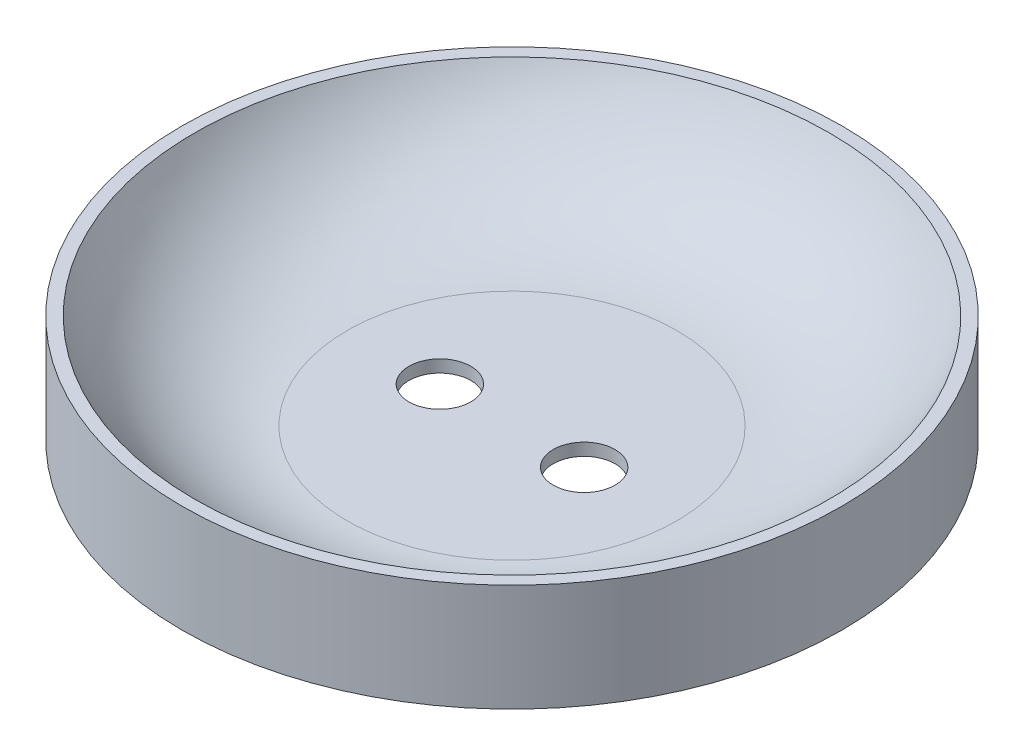
ISO-10303-21;
HEADER;
FILE_DESCRIPTION(('STEP AP214'),'2;1');
FILE_NAME('part.step','',(''),(''),'','','');
FILE_SCHEMA(('AUTOMOTIVE_DESIGN { 1 0 10303 214 1 1 1 1 }'));
ENDSEC;
DATA;
#1=APPLICATION_CONTEXT('core data for automotive mechanical design processes');
#2=APPLICATION_PROTOCOL_DEFINITION('international standard','automotive_design',2000,#1);
#3=PRODUCT_CONTEXT('',#1,'mechanical');
#4=PRODUCT('Part','Part','',(#3));
#5=PRODUCT_RELATED_PRODUCT_CATEGORY('part','',(#4));
#6=PRODUCT_DEFINITION_FORMATION('','',#4);
#7=PRODUCT_DEFINITION_CONTEXT('part definition',#1,'design');
#8=PRODUCT_DEFINITION('design','',#6,#7);
#9=PRODUCT_DEFINITION_SHAPE('','',#8);
#10=(LENGTH_UNIT() NAMED_UNIT(*) SI_UNIT(.MILLI.,.METRE.));
#11=(NAMED_UNIT(*) PLANE_ANGLE_UNIT() SI_UNIT($,.RADIAN.));
#12=(NAMED_UNIT(*) SI_UNIT($,.STERADIAN.) SOLID_ANGLE_UNIT());
#13=UNCERTAINTY_MEASURE_WITH_UNIT(LENGTH_MEASURE(1.E-05),#10,'distance_accuracy_value','');
#14=(GEOMETRIC_REPRESENTATION_CONTEXT(3) GLOBAL_UNCERTAINTY_ASSIGNED_CONTEXT((#13)) GLOBAL_UNIT_ASSIGNED_CONTEXT((#10,
#11,#12)) REPRESENTATION_CONTEXT('',''));
#15=CARTESIAN_POINT('',(0.,0.,0.));
#16=DIRECTION('',(0.,0.,1.));
#17=DIRECTION('',(1.,0.,0.));
#18=AXIS2_PLACEMENT_3D('',#15,#16,#17);
#19=CARTESIAN_POINT('',(0.,0.,0.));
#20=DIRECTION('',(0.,-1.,0.));
#21=DIRECTION('',(0.,0.,-1.));
#22=AXIS2_PLACEMENT_3D('',#19,#20,#21);
#23=PLANE('',#22);
#24=CARTESIAN_POINT('',(-22.225,0.,0.));
#25=DIRECTION('',(0.,-1.,0.));
#26=DIRECTION('',(0.,0.,-1.));
#27=AXIS2_PLACEMENT_3D('',#24,#25,#26);
#28=CIRCLE('',#27,9.525);
#29=CARTESIAN_POINT('',(-22.225,0.,-9.525));
#30=VERTEX_POINT('',#29);
#31=EDGE_CURVE('E70',#30,#30,#28,.T.);
#32=ORIENTED_EDGE('',*,*,#31,.F.);
#33=EDGE_LOOP('',(#32));
#34=FACE_BOUND('',#33,.T.);
#35=CARTESIAN_POINT('',(22.225,0.,0.));
#36=DIRECTION('',(0.,-1.,0.));
#37=DIRECTION('',(0.,0.,-1.));
#38=AXIS2_PLACEMENT_3D('',#35,#36,#37);
#39=CIRCLE('',#38,9.525);
#40=CARTESIAN_POINT('',(22.225,0.,-9.525));
#41=VERTEX_POINT('',#40);
#42=EDGE_CURVE('E97',#41,#41,#39,.T.);
#43=ORIENTED_EDGE('',*,*,#42,.F.);
#44=EDGE_LOOP('',(#43));
#45=FACE_BOUND('',#44,.T.);
#46=CARTESIAN_POINT('',(0.,0.,0.));
#47=DIRECTION('',(0.,-1.,0.));
#48=DIRECTION('',(0.,0.,-1.));
#49=AXIS2_PLACEMENT_3D('',#46,#47,#48);
#50=CIRCLE('',#49,50.8);
#51=CARTESIAN_POINT('',(0.,0.,-50.8));
#52=VERTEX_POINT('',#51);
#53=EDGE_CURVE('E60',#52,#52,#50,.T.);
#54=ORIENTED_EDGE('',*,*,#53,.T.);
#55=EDGE_LOOP('',(#54));
#56=FACE_BOUND('',#55,.T.);
#57=ADVANCED_FACE('F36',(#34,#45,#56),#23,.T.);
#58=CARTESIAN_POINT('',(0.,56.16575,0.));
#59=DIRECTION('',(0.,-1.,0.));
#60=DIRECTION('',(0.,0.,-1.));
#61=AXIS2_PLACEMENT_3D('',#58,#59,#60);
#62=DEGENERATE_TOROIDAL_SURFACE('',#61,50.8,56.16575,.T.);
#63=CARTESIAN_POINT('',(0.,25.4,0.));
#64=DIRECTION('',(0.,-1.,0.));
#65=DIRECTION('',(0.,0.,-1.));
#66=AXIS2_PLACEMENT_3D('',#63,#64,#65);
#67=CIRCLE('',#66,97.79);
#68=CARTESIAN_POINT('',(0.,25.4,-97.79));
#69=VERTEX_POINT('',#68);
#70=EDGE_CURVE('E74',#69,#69,#67,.T.);
#71=ORIENTED_EDGE('',*,*,#70,.T.);
#72=EDGE_LOOP('',(#71));
#73=FACE_BOUND('',#72,.T.);
#74=ORIENTED_EDGE('',*,*,#53,.F.);
#75=EDGE_LOOP('',(#74));
#76=FACE_BOUND('',#75,.T.);
#77=ADVANCED_FACE('F261',(#73,#76),#62,.T.);
#78=CARTESIAN_POINT('',(0.,0.,0.));
#79=DIRECTION('',(0.,-1.,0.));
#80=DIRECTION('',(0.,0.,-1.));
#81=AXIS2_PLACEMENT_3D('',#78,#79,#80);
#82=CYLINDRICAL_SURFACE('',#81,97.79);
#83=CARTESIAN_POINT('',(0.,5.08,0.));
#84=DIRECTION('',(0.,1.,0.));
#85=DIRECTION('',(0.,0.,1.));
#86=AXIS2_PLACEMENT_3D('',#83,#84,#85);
#87=CIRCLE('',#86,97.79);
#88=CARTESIAN_POINT('',(0.,5.08,97.79));
#89=VERTEX_POINT('',#88);
#90=EDGE_CURVE('E10',#89,#89,#87,.F.);
#91=ORIENTED_EDGE('',*,*,#90,.T.);
#92=EDGE_LOOP('',(#91));
#93=FACE_BOUND('',#92,.T.);
#94=ORIENTED_EDGE('',*,*,#70,.F.);
#95=EDGE_LOOP('',(#94));
#96=FACE_BOUND('',#95,.T.);
#97=ADVANCED_FACE('F257',(#93,#96),#82,.F.);
#98=CARTESIAN_POINT('',(97.79,3.81,0.));
#99=DIRECTION('',(0.,1.,0.));
#100=DIRECTION('',(0.,0.,1.));
#101=AXIS2_PLACEMENT_3D('',#98,#99,#100);
#102=PLANE('',#101);
#103=CARTESIAN_POINT('',(0.,3.81,0.));
#104=DIRECTION('',(0.,1.,0.));
#105=DIRECTION('',(0.,0.,1.));
#106=AXIS2_PLACEMENT_3D('',#103,#104,#105);
#107=CIRCLE('',#106,80.01);
#108=CARTESIAN_POINT('',(0.,3.81,80.01));
#109=VERTEX_POINT('',#108);
#110=EDGE_CURVE('E49',#109,#109,#107,.F.);
#111=ORIENTED_EDGE('',*,*,#110,.T.);
#112=EDGE_LOOP('',(#111));
#113=FACE_BOUND('',#112,.T.);
#114=CARTESIAN_POINT('',(0.,3.81,0.));
#115=DIRECTION('',(0.,1.,0.));
#116=DIRECTION('',(0.,0.,1.));
#117=AXIS2_PLACEMENT_3D('',#114,#115,#116);
#118=CIRCLE('',#117,96.52);
#119=CARTESIAN_POINT('',(0.,3.81,96.52));
#120=VERTEX_POINT('',#119);
#121=EDGE_CURVE('E54',#120,#120,#118,.T.);
#122=ORIENTED_EDGE('',*,*,#121,.T.);
#123=EDGE_LOOP('',(#122));
#124=FACE_BOUND('',#123,.T.);
#125=CARTESIAN_POINT('',(-59.4857109053024,3.81,-66.0655749849405));
#126=DIRECTION('',(0.,1.,0.));
#127=DIRECTION('',(0.,0.,1.));
#128=AXIS2_PLACEMENT_3D('',#125,#126,#127);
#129=CIRCLE('',#128,6.35);
#130=CARTESIAN_POINT('',(-59.4857109053024,3.81,-59.7155749849405));
#131=VERTEX_POINT('',#130);
#132=EDGE_CURVE('E120',#131,#131,#129,.F.);
#133=ORIENTED_EDGE('',*,*,#132,.T.);
#134=EDGE_LOOP('',(#133));
#135=FACE_BOUND('',#134,.T.);
#136=CARTESIAN_POINT('',(-27.4716107999326,3.81,-84.5489242986392));
#137=DIRECTION('',(0.,1.,0.));
#138=DIRECTION('',(0.,0.,1.));
#139=AXIS2_PLACEMENT_3D('',#136,#137,#138);
#140=CIRCLE('',#139,6.35);
#141=CARTESIAN_POINT('',(-27.4716107999326,3.81,-78.1989242986392));
#142=VERTEX_POINT('',#141);
#143=EDGE_CURVE('E171',#142,#142,#140,.F.);
#144=ORIENTED_EDGE('',*,*,#143,.T.);
#145=EDGE_LOOP('',(#144));
#146=FACE_BOUND('',#145,.T.);
#147=CARTESIAN_POINT('',(9.29258038449473,3.81,-88.4129964982395));
#148=DIRECTION('',(0.,1.,0.));
#149=DIRECTION('',(0.,0.,1.));
#150=AXIS2_PLACEMENT_3D('',#147,#148,#149);
#151=CIRCLE('',#150,6.35);
#152=CARTESIAN_POINT('',(9.29258038449473,3.81,-82.0629964982395));
#153=VERTEX_POINT('',#152);
#154=EDGE_CURVE('E163',#153,#153,#151,.F.);
#155=ORIENTED_EDGE('',*,*,#154,.T.);
#156=EDGE_LOOP('',(#155));
#157=FACE_BOUND('',#156,.T.);
#158=CARTESIAN_POINT('',(44.4500000000004,3.81,-76.9896583964364));
#159=DIRECTION('',(0.,1.,0.));
#160=DIRECTION('',(0.,0.,1.));
#161=AXIS2_PLACEMENT_3D('',#158,#159,#160);
#162=CIRCLE('',#161,6.35);
#163=CARTESIAN_POINT('',(44.4500000000004,3.81,-70.6396583964364));
#164=VERTEX_POINT('',#163);
#165=EDGE_CURVE('E155',#164,#164,#162,.F.);
#166=ORIENTED_EDGE('',*,*,#165,.T.);
#167=EDGE_LOOP('',(#166));
#168=FACE_BOUND('',#167,.T.);
#169=CARTESIAN_POINT('',(71.9216107999331,3.81,-52.2541089288005));
#170=DIRECTION('',(0.,1.,0.));
#171=DIRECTION('',(0.,0.,1.));
#172=AXIS2_PLACEMENT_3D('',#169,#170,#171);
#173=CIRCLE('',#172,6.35);
#174=CARTESIAN_POINT('',(71.9216107999331,3.81,-45.9041089288005));
#175=VERTEX_POINT('',#174);
#176=EDGE_CURVE('E147',#175,#175,#173,.F.);
#177=ORIENTED_EDGE('',*,*,#176,.T.);
#178=EDGE_LOOP('',(#177));
#179=FACE_BOUND('',#178,.T.);
#180=CARTESIAN_POINT('',(86.9573217052354,3.81,-18.4833493136983));
#181=DIRECTION('',(0.,1.,0.));
#182=DIRECTION('',(0.,0.,1.));
#183=AXIS2_PLACEMENT_3D('',#180,#181,#182);
#184=CIRCLE('',#183,6.35);
#185=CARTESIAN_POINT('',(86.9573217052354,3.81,-12.1333493136983));
#186=VERTEX_POINT('',#185);
#187=EDGE_CURVE('E139',#186,#186,#184,.F.);
#188=ORIENTED_EDGE('',*,*,#187,.T.);
#189=EDGE_LOOP('',(#188));
#190=FACE_BOUND('',#189,.T.);
#191=CARTESIAN_POINT('',(86.9573217052352,3.81,18.4833493136994));
#192=DIRECTION('',(0.,1.,0.));
#193=DIRECTION('',(0.,0.,1.));
#194=AXIS2_PLACEMENT_3D('',#191,#192,#193);
#195=CIRCLE('',#194,6.35);
#196=CARTESIAN_POINT('',(86.9573217052352,3.81,24.8333493136994));
#197=VERTEX_POINT('',#196);
#198=EDGE_CURVE('E131',#197,#197,#195,.F.);
#199=ORIENTED_EDGE('',*,*,#198,.T.);
#200=EDGE_LOOP('',(#199));
#201=FACE_BOUND('',#200,.T.);
#202=CARTESIAN_POINT('',(71.9216107999324,3.81,52.2541089288015));
#203=DIRECTION('',(0.,1.,0.));
#204=DIRECTION('',(0.,0.,1.));
#205=AXIS2_PLACEMENT_3D('',#202,#203,#204);
#206=CIRCLE('',#205,6.35);
#207=CARTESIAN_POINT('',(71.9216107999324,3.81,58.6041089288015));
#208=VERTEX_POINT('',#207);
#209=EDGE_CURVE('E121',#208,#208,#206,.F.);
#210=ORIENTED_EDGE('',*,*,#209,.T.);
#211=EDGE_LOOP('',(#210));
#212=FACE_BOUND('',#211,.T.);
#213=CARTESIAN_POINT('',(44.4499999999993,3.81,76.989658396437));
#214=DIRECTION('',(0.,1.,0.));
#215=DIRECTION('',(0.,0.,1.));
#216=AXIS2_PLACEMENT_3D('',#213,#214,#215);
#217=CIRCLE('',#216,6.35);
#218=CARTESIAN_POINT('',(44.4499999999993,3.81,83.339658396437));
#219=VERTEX_POINT('',#218);
#220=EDGE_CURVE('E130',#219,#219,#217,.F.);
#221=ORIENTED_EDGE('',*,*,#220,.T.);
#222=EDGE_LOOP('',(#221));
#223=FACE_BOUND('',#222,.T.);
#224=CARTESIAN_POINT('',(9.29258038449351,3.81,88.4129964982396));
#225=DIRECTION('',(0.,1.,0.));
#226=DIRECTION('',(0.,0.,1.));
#227=AXIS2_PLACEMENT_3D('',#224,#225,#226);
#228=CIRCLE('',#227,6.35);
#229=CARTESIAN_POINT('',(9.29258038449351,3.81,94.7629964982396));
#230=VERTEX_POINT('',#229);
#231=EDGE_CURVE('E210',#230,#230,#228,.F.);
#232=ORIENTED_EDGE('',*,*,#231,.T.);
#233=EDGE_LOOP('',(#232));
#234=FACE_BOUND('',#233,.T.);
#235=CARTESIAN_POINT('',(-27.4716107999337,3.81,84.5489242986389));
#236=DIRECTION('',(0.,1.,0.));
#237=DIRECTION('',(0.,0.,1.));
#238=AXIS2_PLACEMENT_3D('',#235,#236,#237);
#239=CIRCLE('',#238,6.35);
#240=CARTESIAN_POINT('',(-27.4716107999337,3.81,90.8989242986389));
#241=VERTEX_POINT('',#240);
#242=EDGE_CURVE('E202',#241,#241,#239,.F.);
#243=ORIENTED_EDGE('',*,*,#242,.T.);
#244=EDGE_LOOP('',(#243));
#245=FACE_BOUND('',#244,.T.);
#246=CARTESIAN_POINT('',(-59.4857109053033,3.81,66.0655749849396));
#247=DIRECTION('',(0.,1.,0.));
#248=DIRECTION('',(0.,0.,1.));
#249=AXIS2_PLACEMENT_3D('',#246,#247,#248);
#250=CIRCLE('',#249,6.35);
#251=CARTESIAN_POINT('',(-59.4857109053033,3.81,72.4155749849396));
#252=VERTEX_POINT('',#251);
#253=EDGE_CURVE('E194',#252,#252,#250,.F.);
#254=ORIENTED_EDGE('',*,*,#253,.T.);
#255=EDGE_LOOP('',(#254));
#256=FACE_BOUND('',#255,.T.);
#257=CARTESIAN_POINT('',(-81.2141911844277,3.81,36.1588875694376));
#258=DIRECTION('',(0.,1.,0.));
#259=DIRECTION('',(0.,0.,1.));
#260=AXIS2_PLACEMENT_3D('',#257,#258,#259);
#261=CIRCLE('',#260,6.35);
#262=CARTESIAN_POINT('',(-81.2141911844277,3.81,42.5088875694376));
#263=VERTEX_POINT('',#262);
#264=EDGE_CURVE('E185',#263,#263,#261,.F.);
#265=ORIENTED_EDGE('',*,*,#264,.T.);
#266=EDGE_LOOP('',(#265));
#267=FACE_BOUND('',#266,.T.);
#268=CARTESIAN_POINT('',(-81.2141911844272,3.81,-36.1588875694387));
#269=DIRECTION('',(0.,1.,0.));
#270=DIRECTION('',(0.,0.,1.));
#271=AXIS2_PLACEMENT_3D('',#268,#269,#270);
#272=CIRCLE('',#271,6.35);
#273=CARTESIAN_POINT('',(-81.2141911844272,3.81,-29.8088875694387));
#274=VERTEX_POINT('',#273);
#275=EDGE_CURVE('E112',#274,#274,#272,.F.);
#276=ORIENTED_EDGE('',*,*,#275,.T.);
#277=EDGE_LOOP('',(#276));
#278=FACE_BOUND('',#277,.T.);
#279=CARTESIAN_POINT('',(-88.9,3.81,0.));
#280=DIRECTION('',(0.,1.,0.));
#281=DIRECTION('',(0.,0.,1.));
#282=AXIS2_PLACEMENT_3D('',#279,#280,#281);
#283=CIRCLE('',#282,6.35);
#284=CARTESIAN_POINT('',(-88.9,3.81,6.34999999999998));
#285=VERTEX_POINT('',#284);
#286=EDGE_CURVE('E101',#285,#285,#283,.F.);
#287=ORIENTED_EDGE('',*,*,#286,.T.);
#288=EDGE_LOOP('',(#287));
#289=FACE_BOUND('',#288,.T.);
#290=ADVANCED_FACE('F252',(#113,#124,#135,#146,#157,#168,#179,#190,#201,#212,#223,#234,#245,
#256,#267,#278,#289),#102,.T.);
#291=CARTESIAN_POINT('',(0.,0.,0.));
#292=DIRECTION('',(0.,-1.,0.));
#293=DIRECTION('',(0.,0.,-1.));
#294=AXIS2_PLACEMENT_3D('',#291,#292,#293);
#295=CYLINDRICAL_SURFACE('',#294,78.74);
#296=CARTESIAN_POINT('',(0.,2.54,0.));
#297=DIRECTION('',(0.,1.,0.));
#298=DIRECTION('',(0.,0.,1.));
#299=AXIS2_PLACEMENT_3D('',#296,#297,#298);
#300=CIRCLE('',#299,78.74);
#301=CARTESIAN_POINT('',(0.,2.54,78.74));
#302=VERTEX_POINT('',#301);
#303=EDGE_CURVE('E44',#302,#302,#300,.T.);
#304=ORIENTED_EDGE('',*,*,#303,.T.);
#305=EDGE_LOOP('',(#304));
#306=FACE_BOUND('',#305,.T.);
#307=CARTESIAN_POINT('',(0.,0.,0.));
#308=DIRECTION('',(0.,-1.,0.));
#309=DIRECTION('',(0.,0.,-1.));
#310=AXIS2_PLACEMENT_3D('',#307,#308,#309);
#311=CIRCLE('',#310,78.74);
#312=CARTESIAN_POINT('',(0.,0.,-78.74));
#313=VERTEX_POINT('',#312);
#314=EDGE_CURVE('E78',#313,#313,#311,.T.);
#315=ORIENTED_EDGE('',*,*,#314,.T.);
#316=EDGE_LOOP('',(#315));
#317=FACE_BOUND('',#316,.T.);
#318=ADVANCED_FACE('F232',(#306,#317),#295,.F.);
#319=CARTESIAN_POINT('',(101.6,0.,0.));
#320=DIRECTION('',(0.,-1.,0.));
#321=DIRECTION('',(0.,0.,-1.));
#322=AXIS2_PLACEMENT_3D('',#319,#320,#321);
#323=PLANE('',#322);
#324=CARTESIAN_POINT('',(-59.4857109053024,0.,-66.0655749849405));
#325=DIRECTION('',(0.,-1.,0.));
#326=DIRECTION('',(0.743144825477395,0.,-0.669130606358857));
#327=AXIS2_PLACEMENT_3D('',#324,#325,#326);
#328=CIRCLE('',#327,6.35);
#329=CARTESIAN_POINT('',(-54.7667412635209,0.,-70.3145543353192));
#330=VERTEX_POINT('',#329);
#331=EDGE_CURVE('E175',#330,#330,#328,.T.);
#332=ORIENTED_EDGE('',*,*,#331,.F.);
#333=EDGE_LOOP('',(#332));
#334=FACE_BOUND('',#333,.T.);
#335=CARTESIAN_POINT('',(-27.4716107999326,0.,-84.5489242986392));
#336=DIRECTION('',(0.,-1.,0.));
#337=DIRECTION('',(0.951056516295154,0.,-0.309016994374945));
#338=AXIS2_PLACEMENT_3D('',#335,#336,#337);
#339=CIRCLE('',#338,6.35);
#340=CARTESIAN_POINT('',(-21.4324019214584,0.,-86.5111822129201));
#341=VERTEX_POINT('',#340);
#342=EDGE_CURVE('E167',#341,#341,#339,.T.);
#343=ORIENTED_EDGE('',*,*,#342,.F.);
#344=EDGE_LOOP('',(#343));
#345=FACE_BOUND('',#344,.T.);
#346=CARTESIAN_POINT('',(9.29258038449473,0.,-88.4129964982395));
#347=DIRECTION('',(0.,-1.,0.));
#348=DIRECTION('',(0.994521895368273,0.,0.104528463267657));
#349=AXIS2_PLACEMENT_3D('',#346,#347,#348);
#350=CIRCLE('',#349,6.35);
#351=CARTESIAN_POINT('',(15.6077944200833,0.,-87.7492407564898));
#352=VERTEX_POINT('',#351);
#353=EDGE_CURVE('E159',#352,#352,#350,.T.);
#354=ORIENTED_EDGE('',*,*,#353,.F.);
#355=EDGE_LOOP('',(#354));
#356=FACE_BOUND('',#355,.T.);
#357=CARTESIAN_POINT('',(44.4500000000004,0.,-76.9896583964364));
#358=DIRECTION('',(0.,-1.,0.));
#359=DIRECTION('',(0.866025403784436,0.,0.500000000000004));
#360=AXIS2_PLACEMENT_3D('',#357,#358,#359);
#361=CIRCLE('',#360,6.35);
#362=CARTESIAN_POINT('',(49.9492613140315,0.,-73.8146583964364));
#363=VERTEX_POINT('',#362);
#364=EDGE_CURVE('E151',#363,#363,#361,.T.);
#365=ORIENTED_EDGE('',*,*,#364,.F.);
#366=EDGE_LOOP('',(#365));
#367=FACE_BOUND('',#366,.T.);
#368=CARTESIAN_POINT('',(71.9216107999331,0.,-52.2541089288005));
#369=DIRECTION('',(0.,-1.,0.));
#370=DIRECTION('',(0.587785252292469,0.,0.80901699437495));
#371=AXIS2_PLACEMENT_3D('',#368,#369,#370);
#372=CIRCLE('',#371,6.35);
#373=CARTESIAN_POINT('',(75.6540471519903,0.,-47.1168510145195));
#374=VERTEX_POINT('',#373);
#375=EDGE_CURVE('E143',#374,#374,#372,.T.);
#376=ORIENTED_EDGE('',*,*,#375,.F.);
#377=EDGE_LOOP('',(#376));
#378=FACE_BOUND('',#377,.T.);
#379=CARTESIAN_POINT('',(86.9573217052354,0.,-18.4833493136983));
#380=DIRECTION('',(0.,-1.,0.));
#381=DIRECTION('',(0.207911690817753,0.,0.978147600733807));
#382=AXIS2_PLACEMENT_3D('',#379,#380,#381);
#383=CIRCLE('',#382,6.35);
#384=CARTESIAN_POINT('',(88.2775609419282,0.,-12.2721120490386));
#385=VERTEX_POINT('',#384);
#386=EDGE_CURVE('E135',#385,#385,#383,.T.);
#387=ORIENTED_EDGE('',*,*,#386,.F.);
#388=EDGE_LOOP('',(#387));
#389=FACE_BOUND('',#388,.T.);
#390=CARTESIAN_POINT('',(86.9573217052352,0.,18.4833493136994));
#391=DIRECTION('',(0.,-1.,0.));
#392=DIRECTION('',(-0.207911690817766,0.,0.978147600733804));
#393=AXIS2_PLACEMENT_3D('',#390,#391,#392);
#394=CIRCLE('',#393,6.35);
#395=CARTESIAN_POINT('',(85.6370824685424,0.,24.6945865783591));
#396=VERTEX_POINT('',#395);
#397=EDGE_CURVE('E125',#396,#396,#394,.T.);
#398=ORIENTED_EDGE('',*,*,#397,.F.);
#399=EDGE_LOOP('',(#398));
#400=FACE_BOUND('',#399,.T.);
#401=CARTESIAN_POINT('',(71.9216107999324,0.,52.2541089288015));
#402=DIRECTION('',(0.,-1.,0.));
#403=DIRECTION('',(-0.58778525229248,0.,0.809016994374943));
#404=AXIS2_PLACEMENT_3D('',#401,#402,#403);
#405=CIRCLE('',#404,6.35);
#406=CARTESIAN_POINT('',(68.1891744478751,0.,57.3913668430823));
#407=VERTEX_POINT('',#406);
#408=EDGE_CURVE('E126',#407,#407,#405,.T.);
#409=ORIENTED_EDGE('',*,*,#408,.F.);
#410=EDGE_LOOP('',(#409));
#411=FACE_BOUND('',#410,.T.);
#412=CARTESIAN_POINT('',(44.4499999999993,0.,76.989658396437));
#413=DIRECTION('',(0.,-1.,0.));
#414=DIRECTION('',(-0.866025403784443,0.,0.499999999999992));
#415=AXIS2_PLACEMENT_3D('',#412,#413,#414);
#416=CIRCLE('',#415,6.35);
#417=CARTESIAN_POINT('',(38.9507386859681,0.,80.1646583964369));
#418=VERTEX_POINT('',#417);
#419=EDGE_CURVE('E214',#418,#418,#416,.T.);
#420=ORIENTED_EDGE('',*,*,#419,.F.);
#421=EDGE_LOOP('',(#420));
#422=FACE_BOUND('',#421,.T.);
#423=CARTESIAN_POINT('',(9.29258038449351,0.,88.4129964982396));
#424=DIRECTION('',(0.,-1.,0.));
#425=DIRECTION('',(-0.994521895368274,0.,0.104528463267644));
#426=AXIS2_PLACEMENT_3D('',#423,#424,#425);
#427=CIRCLE('',#426,6.35);
#428=CARTESIAN_POINT('',(2.97736634890497,0.,89.0767522399891));
#429=VERTEX_POINT('',#428);
#430=EDGE_CURVE('E206',#429,#429,#427,.T.);
#431=ORIENTED_EDGE('',*,*,#430,.F.);
#432=EDGE_LOOP('',(#431));
#433=FACE_BOUND('',#432,.T.);
#434=CARTESIAN_POINT('',(-27.4716107999337,0.,84.5489242986389));
#435=DIRECTION('',(0.,-1.,0.));
#436=DIRECTION('',(-0.95105651629515,0.,-0.309016994374957));
#437=AXIS2_PLACEMENT_3D('',#434,#435,#436);
#438=CIRCLE('',#437,6.35);
#439=CARTESIAN_POINT('',(-33.5108196784079,0.,82.5866663843579));
#440=VERTEX_POINT('',#439);
#441=EDGE_CURVE('E198',#440,#440,#438,.T.);
#442=ORIENTED_EDGE('',*,*,#441,.F.);
#443=EDGE_LOOP('',(#442));
#444=FACE_BOUND('',#443,.T.);
#445=CARTESIAN_POINT('',(-59.4857109053033,0.,66.0655749849396));
#446=DIRECTION('',(0.,-1.,0.));
#447=DIRECTION('',(-0.743144825477386,0.,-0.669130606358867));
#448=AXIS2_PLACEMENT_3D('',#445,#446,#447);
#449=CIRCLE('',#448,6.35);
#450=CARTESIAN_POINT('',(-64.2046805470847,0.,61.8165956345608));
#451=VERTEX_POINT('',#450);
#452=EDGE_CURVE('E189',#451,#451,#449,.T.);
#453=ORIENTED_EDGE('',*,*,#452,.F.);
#454=EDGE_LOOP('',(#453));
#455=FACE_BOUND('',#454,.T.);
#456=CARTESIAN_POINT('',(-81.2141911844277,0.,36.1588875694376));
#457=DIRECTION('',(0.,-1.,0.));
#458=DIRECTION('',(-0.406736643075789,0.,-0.913545457642606));
#459=AXIS2_PLACEMENT_3D('',#456,#457,#458);
#460=CIRCLE('',#459,6.35);
#461=CARTESIAN_POINT('',(-83.7969688679589,0.,30.3578739134071));
#462=VERTEX_POINT('',#461);
#463=EDGE_CURVE('E190',#462,#462,#460,.T.);
#464=ORIENTED_EDGE('',*,*,#463,.F.);
#465=EDGE_LOOP('',(#464));
#466=FACE_BOUND('',#465,.T.);
#467=CARTESIAN_POINT('',(-81.2141911844272,0.,-36.1588875694387));
#468=DIRECTION('',(0.,-1.,0.));
#469=DIRECTION('',(0.406736643075801,0.,-0.913545457642601));
#470=AXIS2_PLACEMENT_3D('',#467,#468,#469);
#471=CIRCLE('',#470,6.35);
#472=CARTESIAN_POINT('',(-78.6314135008958,0.,-41.9599012254692));
#473=VERTEX_POINT('',#472);
#474=EDGE_CURVE('E116',#473,#473,#471,.T.);
#475=ORIENTED_EDGE('',*,*,#474,.F.);
#476=EDGE_LOOP('',(#475));
#477=FACE_BOUND('',#476,.T.);
#478=CARTESIAN_POINT('',(-88.9,0.,0.));
#479=DIRECTION('',(0.,-1.,0.));
#480=DIRECTION('',(0.,0.,-1.));
#481=AXIS2_PLACEMENT_3D('',#478,#479,#480);
#482=CIRCLE('',#481,6.35);
#483=CARTESIAN_POINT('',(-88.9,0.,-6.35000000000001));
#484=VERTEX_POINT('',#483);
#485=EDGE_CURVE('E108',#484,#484,#482,.T.);
#486=ORIENTED_EDGE('',*,*,#485,.F.);
#487=EDGE_LOOP('',(#486));
#488=FACE_BOUND('',#487,.T.);
#489=CARTESIAN_POINT('',(0.,0.,0.));
#490=DIRECTION('',(0.,-1.,0.));
#491=DIRECTION('',(0.,0.,-1.));
#492=AXIS2_PLACEMENT_3D('',#489,#490,#491);
#493=CIRCLE('',#492,101.6);
#494=CARTESIAN_POINT('',(0.,0.,-101.6));
#495=VERTEX_POINT('',#494);
#496=EDGE_CURVE('E82',#495,#495,#493,.T.);
#497=ORIENTED_EDGE('',*,*,#496,.T.);
#498=EDGE_LOOP('',(#497));
#499=FACE_BOUND('',#498,.T.);
#500=ORIENTED_EDGE('',*,*,#314,.F.);
#501=EDGE_LOOP('',(#500));
#502=FACE_BOUND('',#501,.T.);
#503=ADVANCED_FACE('F228',(#334,#345,#356,#367,#378,#389,#400,#411,#422,#433,#444,#455,#466,
#477,#488,#499,#502),#323,.T.);
#504=CARTESIAN_POINT('',(0.,0.,0.));
#505=DIRECTION('',(0.,-1.,0.));
#506=DIRECTION('',(0.,0.,-1.));
#507=AXIS2_PLACEMENT_3D('',#504,#505,#506);
#508=CYLINDRICAL_SURFACE('',#507,101.6);
#509=CARTESIAN_POINT('',(0.,33.0775612866665,0.));
#510=DIRECTION('',(0.,-1.,0.));
#511=DIRECTION('',(0.,0.,-1.));
#512=AXIS2_PLACEMENT_3D('',#509,#510,#511);
#513=CIRCLE('',#512,101.6);
#514=CARTESIAN_POINT('',(0.,33.0775612866665,-101.6));
#515=VERTEX_POINT('',#514);
#516=EDGE_CURVE('E86',#515,#515,#513,.T.);
#517=ORIENTED_EDGE('',*,*,#516,.T.);
#518=EDGE_LOOP('',(#517));
#519=FACE_BOUND('',#518,.T.);
#520=ORIENTED_EDGE('',*,*,#496,.F.);
#521=EDGE_LOOP('',(#520));
#522=FACE_BOUND('',#521,.T.);
#523=ADVANCED_FACE('F231',(#519,#522),#508,.T.);
#524=CARTESIAN_POINT('',(97.79,33.0775612866665,0.));
#525=DIRECTION('',(0.,1.,0.));
#526=DIRECTION('',(0.,0.,1.));
#527=AXIS2_PLACEMENT_3D('',#524,#525,#526);
#528=PLANE('',#527);
#529=CARTESIAN_POINT('',(0.,33.0775612866665,0.));
#530=DIRECTION('',(0.,-1.,0.));
#531=DIRECTION('',(0.,0.,-1.));
#532=AXIS2_PLACEMENT_3D('',#529,#530,#531);
#533=CIRCLE('',#532,97.79);
#534=CARTESIAN_POINT('',(0.,33.0775612866665,-97.79));
#535=VERTEX_POINT('',#534);
#536=EDGE_CURVE('E90',#535,#535,#533,.T.);
#537=ORIENTED_EDGE('',*,*,#536,.T.);
#538=EDGE_LOOP('',(#537));
#539=FACE_BOUND('',#538,.T.);
#540=ORIENTED_EDGE('',*,*,#516,.F.);
#541=EDGE_LOOP('',(#540));
#542=FACE_BOUND('',#541,.T.);
#543=ADVANCED_FACE('F347',(#539,#542),#528,.T.);
#544=CARTESIAN_POINT('',(0.,56.16575,0.));
#545=DIRECTION('',(0.,-1.,0.));
#546=DIRECTION('',(0.,0.,-1.));
#547=AXIS2_PLACEMENT_3D('',#544,#545,#546);
#548=DEGENERATE_TOROIDAL_SURFACE('',#547,50.8,52.35575,.T.);
#549=CARTESIAN_POINT('',(0.,3.81,0.));
#550=DIRECTION('',(0.,-1.,0.));
#551=DIRECTION('',(0.,0.,-1.));
#552=AXIS2_PLACEMENT_3D('',#549,#550,#551);
#553=CIRCLE('',#552,50.8);
#554=CARTESIAN_POINT('',(0.,3.81,-50.8));
#555=VERTEX_POINT('',#554);
#556=EDGE_CURVE('E65',#555,#555,#553,.T.);
#557=ORIENTED_EDGE('',*,*,#556,.T.);
#558=EDGE_LOOP('',(#557));
#559=FACE_BOUND('',#558,.T.);
#560=ORIENTED_EDGE('',*,*,#536,.F.);
#561=EDGE_LOOP('',(#560));
#562=FACE_BOUND('',#561,.T.);
#563=ADVANCED_FACE('F343',(#559,#562),#548,.F.);
#564=CARTESIAN_POINT('',(0.,3.81,0.));
#565=DIRECTION('',(0.,1.,0.));
#566=DIRECTION('',(0.,0.,1.));
#567=AXIS2_PLACEMENT_3D('',#564,#565,#566);
#568=PLANE('',#567);
#569=CARTESIAN_POINT('',(-22.225,3.81,0.));
#570=DIRECTION('',(0.,1.,0.));
#571=DIRECTION('',(0.,0.,1.));
#572=AXIS2_PLACEMENT_3D('',#569,#570,#571);
#573=CIRCLE('',#572,9.525);
#574=CARTESIAN_POINT('',(-22.225,3.81,9.525));
#575=VERTEX_POINT('',#574);
#576=EDGE_CURVE('E61',#575,#575,#573,.T.);
#577=ORIENTED_EDGE('',*,*,#576,.F.);
#578=EDGE_LOOP('',(#577));
#579=FACE_BOUND('',#578,.T.);
#580=CARTESIAN_POINT('',(22.225,3.81,0.));
#581=DIRECTION('',(0.,1.,0.));
#582=DIRECTION('',(0.,0.,1.));
#583=AXIS2_PLACEMENT_3D('',#580,#581,#582);
#584=CIRCLE('',#583,9.525);
#585=CARTESIAN_POINT('',(22.225,3.81,9.525));
#586=VERTEX_POINT('',#585);
#587=EDGE_CURVE('E66',#586,#586,#584,.T.);
#588=ORIENTED_EDGE('',*,*,#587,.F.);
#589=EDGE_LOOP('',(#588));
#590=FACE_BOUND('',#589,.T.);
#591=ORIENTED_EDGE('',*,*,#556,.F.);
#592=EDGE_LOOP('',(#591));
#593=FACE_BOUND('',#592,.T.);
#594=ADVANCED_FACE('F339',(#579,#590,#593),#568,.T.);
#595=CARTESIAN_POINT('',(22.225,33.0775612866665,0.));
#596=DIRECTION('',(0.,-1.,0.));
#597=DIRECTION('',(0.,0.,-1.));
#598=AXIS2_PLACEMENT_3D('',#595,#596,#597);
#599=CYLINDRICAL_SURFACE('',#598,9.525);
#600=ORIENTED_EDGE('',*,*,#587,.T.);
#601=EDGE_LOOP('',(#600));
#602=FACE_BOUND('',#601,.T.);
#603=ORIENTED_EDGE('',*,*,#42,.T.);
#604=EDGE_LOOP('',(#603));
#605=FACE_BOUND('',#604,.T.);
#606=ADVANCED_FACE('F332',(#602,#605),#599,.F.);
#607=CARTESIAN_POINT('',(-22.225,33.0775612866665,0.));
#608=DIRECTION('',(0.,-1.,0.));
#609=DIRECTION('',(0.,0.,-1.));
#610=AXIS2_PLACEMENT_3D('',#607,#608,#609);
#611=CYLINDRICAL_SURFACE('',#610,9.525);
#612=ORIENTED_EDGE('',*,*,#576,.T.);
#613=EDGE_LOOP('',(#612));
#614=FACE_BOUND('',#613,.T.);
#615=ORIENTED_EDGE('',*,*,#31,.T.);
#616=EDGE_LOOP('',(#615));
#617=FACE_BOUND('',#616,.T.);
#618=ADVANCED_FACE('F322',(#614,#617),#611,.F.);
#619=CARTESIAN_POINT('',(-88.9,21.7705122421383,0.));
#620=DIRECTION('',(0.,-1.,0.));
#621=DIRECTION('',(0.,0.,-1.));
#622=AXIS2_PLACEMENT_3D('',#619,#620,#621);
#623=CYLINDRICAL_SURFACE('',#622,6.35);
#624=ORIENTED_EDGE('',*,*,#485,.T.);
#625=EDGE_LOOP('',(#624));
#626=FACE_BOUND('',#625,.T.);
#627=ORIENTED_EDGE('',*,*,#286,.F.);
#628=EDGE_LOOP('',(#627));
#629=FACE_BOUND('',#628,.T.);
#630=ADVANCED_FACE('F319',(#626,#629),#623,.F.);
#631=CARTESIAN_POINT('',(-81.2141911844272,21.7705122421383,-36.1588875694387));
#632=DIRECTION('',(0.,-1.,0.));
#633=DIRECTION('',(0.,0.,-1.));
#634=AXIS2_PLACEMENT_3D('',#631,#632,#633);
#635=CYLINDRICAL_SURFACE('',#634,6.35);
#636=ORIENTED_EDGE('',*,*,#474,.T.);
#637=EDGE_LOOP('',(#636));
#638=FACE_BOUND('',#637,.T.);
#639=ORIENTED_EDGE('',*,*,#275,.F.);
#640=EDGE_LOOP('',(#639));
#641=FACE_BOUND('',#640,.T.);
#642=ADVANCED_FACE('F321',(#638,#641),#635,.F.);
#643=CARTESIAN_POINT('',(-81.2141911844277,21.7705122421383,36.1588875694376));
#644=DIRECTION('',(0.,-1.,0.));
#645=DIRECTION('',(0.,0.,-1.));
#646=AXIS2_PLACEMENT_3D('',#643,#644,#645);
#647=CYLINDRICAL_SURFACE('',#646,6.35);
#648=ORIENTED_EDGE('',*,*,#463,.T.);
#649=EDGE_LOOP('',(#648));
#650=FACE_BOUND('',#649,.T.);
#651=ORIENTED_EDGE('',*,*,#264,.F.);
#652=EDGE_LOOP('',(#651));
#653=FACE_BOUND('',#652,.T.);
#654=ADVANCED_FACE('F329',(#650,#653),#647,.F.);
#655=CARTESIAN_POINT('',(-59.4857109053033,21.7705122421383,66.0655749849396));
#656=DIRECTION('',(0.,-1.,0.));
#657=DIRECTION('',(0.,0.,-1.));
#658=AXIS2_PLACEMENT_3D('',#655,#656,#657);
#659=CYLINDRICAL_SURFACE('',#658,6.35);
#660=ORIENTED_EDGE('',*,*,#452,.T.);
#661=EDGE_LOOP('',(#660));
#662=FACE_BOUND('',#661,.T.);
#663=ORIENTED_EDGE('',*,*,#253,.F.);
#664=EDGE_LOOP('',(#663));
#665=FACE_BOUND('',#664,.T.);
#666=ADVANCED_FACE('F406',(#662,#665),#659,.F.);
#667=CARTESIAN_POINT('',(-27.4716107999337,21.7705122421383,84.5489242986389));
#668=DIRECTION('',(0.,-1.,0.));
#669=DIRECTION('',(0.,0.,-1.));
#670=AXIS2_PLACEMENT_3D('',#667,#668,#669);
#671=CYLINDRICAL_SURFACE('',#670,6.35);
#672=ORIENTED_EDGE('',*,*,#441,.T.);
#673=EDGE_LOOP('',(#672));
#674=FACE_BOUND('',#673,.T.);
#675=ORIENTED_EDGE('',*,*,#242,.F.);
#676=EDGE_LOOP('',(#675));
#677=FACE_BOUND('',#676,.T.);
#678=ADVANCED_FACE('F416',(#674,#677),#671,.F.);
#679=CARTESIAN_POINT('',(9.29258038449351,21.7705122421383,88.4129964982396));
#680=DIRECTION('',(0.,-1.,0.));
#681=DIRECTION('',(0.,0.,-1.));
#682=AXIS2_PLACEMENT_3D('',#679,#680,#681);
#683=CYLINDRICAL_SURFACE('',#682,6.35);
#684=ORIENTED_EDGE('',*,*,#430,.T.);
#685=EDGE_LOOP('',(#684));
#686=FACE_BOUND('',#685,.T.);
#687=ORIENTED_EDGE('',*,*,#231,.F.);
#688=EDGE_LOOP('',(#687));
#689=FACE_BOUND('',#688,.T.);
#690=ADVANCED_FACE('F426',(#686,#689),#683,.F.);
#691=CARTESIAN_POINT('',(44.4499999999993,21.7705122421383,76.989658396437));
#692=DIRECTION('',(0.,-1.,0.));
#693=DIRECTION('',(0.,0.,-1.));
#694=AXIS2_PLACEMENT_3D('',#691,#692,#693);
#695=CYLINDRICAL_SURFACE('',#694,6.35);
#696=ORIENTED_EDGE('',*,*,#419,.T.);
#697=EDGE_LOOP('',(#696));
#698=FACE_BOUND('',#697,.T.);
#699=ORIENTED_EDGE('',*,*,#220,.F.);
#700=EDGE_LOOP('',(#699));
#701=FACE_BOUND('',#700,.T.);
#702=ADVANCED_FACE('F225',(#698,#701),#695,.F.);
#703=CARTESIAN_POINT('',(71.9216107999324,21.7705122421383,52.2541089288015));
#704=DIRECTION('',(0.,-1.,0.));
#705=DIRECTION('',(0.,0.,-1.));
#706=AXIS2_PLACEMENT_3D('',#703,#704,#705);
#707=CYLINDRICAL_SURFACE('',#706,6.35);
#708=ORIENTED_EDGE('',*,*,#408,.T.);
#709=EDGE_LOOP('',(#708));
#710=FACE_BOUND('',#709,.T.);
#711=ORIENTED_EDGE('',*,*,#209,.F.);
#712=EDGE_LOOP('',(#711));
#713=FACE_BOUND('',#712,.T.);
#714=ADVANCED_FACE('F445',(#710,#713),#707,.F.);
#715=CARTESIAN_POINT('',(86.9573217052352,21.7705122421383,18.4833493136994));
#716=DIRECTION('',(0.,-1.,0.));
#717=DIRECTION('',(0.,0.,-1.));
#718=AXIS2_PLACEMENT_3D('',#715,#716,#717);
#719=CYLINDRICAL_SURFACE('',#718,6.35);
#720=ORIENTED_EDGE('',*,*,#397,.T.);
#721=EDGE_LOOP('',(#720));
#722=FACE_BOUND('',#721,.T.);
#723=ORIENTED_EDGE('',*,*,#198,.F.);
#724=EDGE_LOOP('',(#723));
#725=FACE_BOUND('',#724,.T.);
#726=ADVANCED_FACE('F454',(#722,#725),#719,.F.);
#727=CARTESIAN_POINT('',(86.9573217052354,21.7705122421383,-18.4833493136983));
#728=DIRECTION('',(0.,-1.,0.));
#729=DIRECTION('',(0.,0.,-1.));
#730=AXIS2_PLACEMENT_3D('',#727,#728,#729);
#731=CYLINDRICAL_SURFACE('',#730,6.35);
#732=ORIENTED_EDGE('',*,*,#386,.T.);
#733=EDGE_LOOP('',(#732));
#734=FACE_BOUND('',#733,.T.);
#735=ORIENTED_EDGE('',*,*,#187,.F.);
#736=EDGE_LOOP('',(#735));
#737=FACE_BOUND('',#736,.T.);
#738=ADVANCED_FACE('F463',(#734,#737),#731,.F.);
#739=CARTESIAN_POINT('',(71.9216107999331,21.7705122421383,-52.2541089288005));
#740=DIRECTION('',(0.,-1.,0.));
#741=DIRECTION('',(0.,0.,-1.));
#742=AXIS2_PLACEMENT_3D('',#739,#740,#741);
#743=CYLINDRICAL_SURFACE('',#742,6.35);
#744=ORIENTED_EDGE('',*,*,#375,.T.);
#745=EDGE_LOOP('',(#744));
#746=FACE_BOUND('',#745,.T.);
#747=ORIENTED_EDGE('',*,*,#176,.F.);
#748=EDGE_LOOP('',(#747));
#749=FACE_BOUND('',#748,.T.);
#750=ADVANCED_FACE('F473',(#746,#749),#743,.F.);
#751=CARTESIAN_POINT('',(44.4500000000004,21.7705122421383,-76.9896583964364));
#752=DIRECTION('',(0.,-1.,0.));
#753=DIRECTION('',(0.,0.,-1.));
#754=AXIS2_PLACEMENT_3D('',#751,#752,#753);
#755=CYLINDRICAL_SURFACE('',#754,6.35);
#756=ORIENTED_EDGE('',*,*,#364,.T.);
#757=EDGE_LOOP('',(#756));
#758=FACE_BOUND('',#757,.T.);
#759=ORIENTED_EDGE('',*,*,#165,.F.);
#760=EDGE_LOOP('',(#759));
#761=FACE_BOUND('',#760,.T.);
#762=ADVANCED_FACE('F483',(#758,#761),#755,.F.);
#763=CARTESIAN_POINT('',(9.29258038449473,21.7705122421383,-88.4129964982395));
#764=DIRECTION('',(0.,-1.,0.));
#765=DIRECTION('',(0.,0.,-1.));
#766=AXIS2_PLACEMENT_3D('',#763,#764,#765);
#767=CYLINDRICAL_SURFACE('',#766,6.35);
#768=ORIENTED_EDGE('',*,*,#353,.T.);
#769=EDGE_LOOP('',(#768));
#770=FACE_BOUND('',#769,.T.);
#771=ORIENTED_EDGE('',*,*,#154,.F.);
#772=EDGE_LOOP('',(#771));
#773=FACE_BOUND('',#772,.T.);
#774=ADVANCED_FACE('F493',(#770,#773),#767,.F.);
#775=CARTESIAN_POINT('',(-27.4716107999326,21.7705122421383,-84.5489242986392));
#776=DIRECTION('',(0.,-1.,0.));
#777=DIRECTION('',(0.,0.,-1.));
#778=AXIS2_PLACEMENT_3D('',#775,#776,#777);
#779=CYLINDRICAL_SURFACE('',#778,6.35);
#780=ORIENTED_EDGE('',*,*,#342,.T.);
#781=EDGE_LOOP('',(#780));
#782=FACE_BOUND('',#781,.T.);
#783=ORIENTED_EDGE('',*,*,#143,.F.);
#784=EDGE_LOOP('',(#783));
#785=FACE_BOUND('',#784,.T.);
#786=ADVANCED_FACE('F281',(#782,#785),#779,.F.);
#787=CARTESIAN_POINT('',(-59.4857109053024,21.7705122421383,-66.0655749849405));
#788=DIRECTION('',(0.,-1.,0.));
#789=DIRECTION('',(0.,0.,-1.));
#790=AXIS2_PLACEMENT_3D('',#787,#788,#789);
#791=CYLINDRICAL_SURFACE('',#790,6.35);
#792=ORIENTED_EDGE('',*,*,#331,.T.);
#793=EDGE_LOOP('',(#792));
#794=FACE_BOUND('',#793,.T.);
#795=ORIENTED_EDGE('',*,*,#132,.F.);
#796=EDGE_LOOP('',(#795));
#797=FACE_BOUND('',#796,.T.);
#798=ADVANCED_FACE('F274',(#794,#797),#791,.F.);
#799=CARTESIAN_POINT('',(0.,2.54,0.));
#800=DIRECTION('',(0.,1.,0.));
#801=DIRECTION('',(0.,0.,1.));
#802=AXIS2_PLACEMENT_3D('',#799,#800,#801);
#803=TOROIDAL_SURFACE('',#802,80.01,1.27);
#804=ORIENTED_EDGE('',*,*,#303,.F.);
#805=EDGE_LOOP('',(#804));
#806=FACE_BOUND('',#805,.T.);
#807=ORIENTED_EDGE('',*,*,#110,.F.);
#808=EDGE_LOOP('',(#807));
#809=FACE_BOUND('',#808,.T.);
#810=ADVANCED_FACE('F272',(#806,#809),#803,.T.);
#811=CARTESIAN_POINT('',(0.,5.08,0.));
#812=DIRECTION('',(0.,1.,0.));
#813=DIRECTION('',(0.,0.,1.));
#814=AXIS2_PLACEMENT_3D('',#811,#812,#813);
#815=TOROIDAL_SURFACE('',#814,96.52,1.27);
#816=ORIENTED_EDGE('',*,*,#121,.F.);
#817=EDGE_LOOP('',(#816));
#818=FACE_BOUND('',#817,.T.);
#819=ORIENTED_EDGE('',*,*,#90,.F.);
#820=EDGE_LOOP('',(#819));
#821=FACE_BOUND('',#820,.T.);
#822=ADVANCED_FACE('F38',(#818,#821),#815,.F.);
#823=CLOSED_SHELL('',(#57,#77,#97,#290,#318,#503,#523,#543,#563,#594,#606,#618,#630,#642,#654,
#666,#678,#690,#702,#714,#726,#738,#750,#762,#774,#786,#798,#810,#822));
#824=MANIFOLD_SOLID_BREP('B2',#823);
#825=ADVANCED_BREP_SHAPE_REPRESENTATION('',(#18,#824),#14);
#826=SHAPE_DEFINITION_REPRESENTATION(#9,#825);
ENDSEC;
END-ISO-10303-21;
